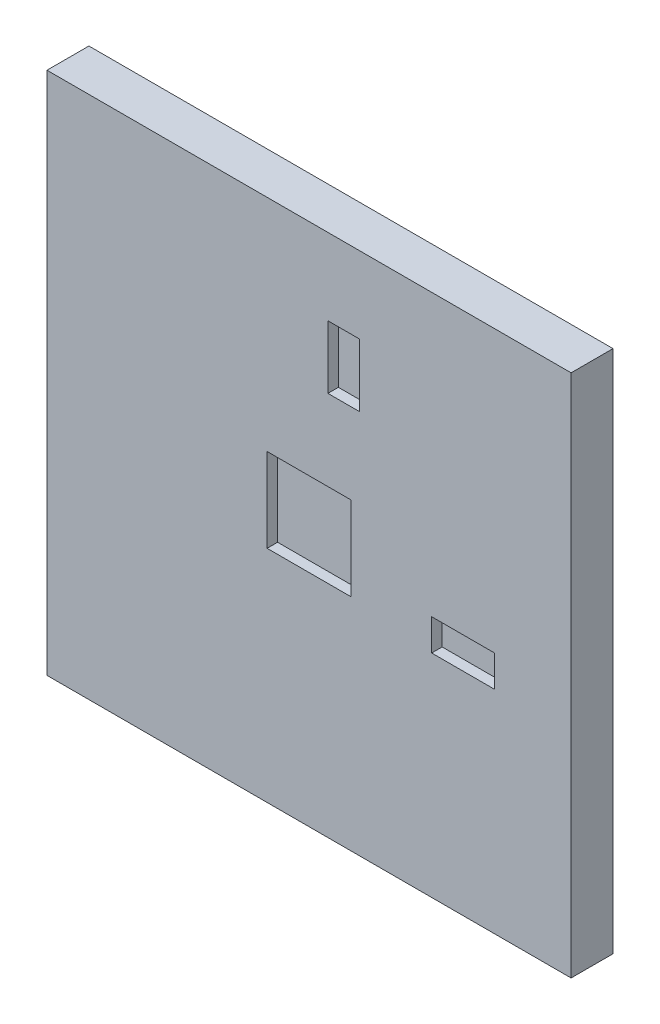
ISO-10303-21;
HEADER;
FILE_DESCRIPTION(('STEP AP214'),'2;1');
FILE_NAME('part.step','',(''),(''),'','','');
FILE_SCHEMA(('AUTOMOTIVE_DESIGN { 1 0 10303 214 1 1 1 1 }'));
ENDSEC;
DATA;
#1=APPLICATION_CONTEXT('core data for automotive mechanical design processes');
#2=APPLICATION_PROTOCOL_DEFINITION('international standard','automotive_design',2000,#1);
#3=PRODUCT_CONTEXT('',#1,'mechanical');
#4=PRODUCT('Part','Part','',(#3));
#5=PRODUCT_RELATED_PRODUCT_CATEGORY('part','',(#4));
#6=PRODUCT_DEFINITION_FORMATION('','',#4);
#7=PRODUCT_DEFINITION_CONTEXT('part definition',#1,'design');
#8=PRODUCT_DEFINITION('design','',#6,#7);
#9=PRODUCT_DEFINITION_SHAPE('','',#8);
#10=(LENGTH_UNIT() NAMED_UNIT(*) SI_UNIT(.MILLI.,.METRE.));
#11=(NAMED_UNIT(*) PLANE_ANGLE_UNIT() SI_UNIT($,.RADIAN.));
#12=(NAMED_UNIT(*) SI_UNIT($,.STERADIAN.) SOLID_ANGLE_UNIT());
#13=UNCERTAINTY_MEASURE_WITH_UNIT(LENGTH_MEASURE(1.E-05),#10,'distance_accuracy_value','');
#14=(GEOMETRIC_REPRESENTATION_CONTEXT(3) GLOBAL_UNCERTAINTY_ASSIGNED_CONTEXT((#13)) GLOBAL_UNIT_ASSIGNED_CONTEXT((#10,
#11,#12)) REPRESENTATION_CONTEXT('',''));
#15=CARTESIAN_POINT('',(0.,0.,0.));
#16=DIRECTION('',(0.,0.,1.));
#17=DIRECTION('',(1.,0.,0.));
#18=AXIS2_PLACEMENT_3D('',#15,#16,#17);
#19=CARTESIAN_POINT('',(147.048407602462,-195.903707865169,20.));
#20=DIRECTION('',(-1.,0.,0.));
#21=DIRECTION('',(0.,0.,1.));
#22=AXIS2_PLACEMENT_3D('',#19,#20,#21);
#23=PLANE('',#22);
#24=DIRECTION('',(0.,1.,0.));
#25=VECTOR('',#24,1.);
#26=CARTESIAN_POINT('',(147.048407602462,-195.903707865169,0.));
#27=LINE('',#26,#25);
#28=CARTESIAN_POINT('',(147.048407602462,-195.903707865169,0.));
#29=VERTEX_POINT('',#28);
#30=CARTESIAN_POINT('',(147.048407602462,54.0962921348315,0.));
#31=VERTEX_POINT('',#30);
#32=EDGE_CURVE('E182',#29,#31,#27,.T.);
#33=ORIENTED_EDGE('',*,*,#32,.T.);
#34=DIRECTION('',(0.,0.,-1.));
#35=VECTOR('',#34,1.);
#36=CARTESIAN_POINT('',(147.048407602462,54.0962921348315,20.));
#37=LINE('',#36,#35);
#38=CARTESIAN_POINT('',(147.048407602462,54.0962921348315,20.));
#39=VERTEX_POINT('',#38);
#40=EDGE_CURVE('E11',#39,#31,#37,.T.);
#41=ORIENTED_EDGE('',*,*,#40,.F.);
#42=DIRECTION('',(0.,1.,0.));
#43=VECTOR('',#42,1.);
#44=CARTESIAN_POINT('',(147.048407602462,-195.903707865169,20.));
#45=LINE('',#44,#43);
#46=CARTESIAN_POINT('',(147.048407602462,-195.903707865169,20.));
#47=VERTEX_POINT('',#46);
#48=EDGE_CURVE('E247',#47,#39,#45,.T.);
#49=ORIENTED_EDGE('',*,*,#48,.F.);
#50=DIRECTION('',(0.,0.,-1.));
#51=VECTOR('',#50,1.);
#52=CARTESIAN_POINT('',(147.048407602462,-195.903707865169,20.));
#53=LINE('',#52,#51);
#54=EDGE_CURVE('E257',#47,#29,#53,.T.);
#55=ORIENTED_EDGE('',*,*,#54,.T.);
#56=EDGE_LOOP('',(#33,#41,#49,#55));
#57=FACE_BOUND('',#56,.T.);
#58=ADVANCED_FACE('F34',(#57),#23,.F.);
#59=CARTESIAN_POINT('',(147.048407602462,54.0962921348315,20.));
#60=DIRECTION('',(0.,-1.,0.));
#61=DIRECTION('',(1.,0.,0.));
#62=AXIS2_PLACEMENT_3D('',#59,#60,#61);
#63=PLANE('',#62);
#64=DIRECTION('',(-1.,0.,0.));
#65=VECTOR('',#64,1.);
#66=CARTESIAN_POINT('',(147.048407602462,54.0962921348315,0.));
#67=LINE('',#66,#65);
#68=CARTESIAN_POINT('',(-102.951592397538,54.0962921348315,0.));
#69=VERTEX_POINT('',#68);
#70=EDGE_CURVE('E260',#31,#69,#67,.T.);
#71=ORIENTED_EDGE('',*,*,#70,.T.);
#72=DIRECTION('',(0.,0.,-1.));
#73=VECTOR('',#72,1.);
#74=CARTESIAN_POINT('',(-102.951592397538,54.0962921348315,20.));
#75=LINE('',#74,#73);
#76=CARTESIAN_POINT('',(-102.951592397538,54.0962921348315,20.));
#77=VERTEX_POINT('',#76);
#78=EDGE_CURVE('E41',#77,#69,#75,.T.);
#79=ORIENTED_EDGE('',*,*,#78,.F.);
#80=DIRECTION('',(-1.,0.,0.));
#81=VECTOR('',#80,1.);
#82=CARTESIAN_POINT('',(147.048407602462,54.0962921348315,20.));
#83=LINE('',#82,#81);
#84=EDGE_CURVE('E250',#39,#77,#83,.T.);
#85=ORIENTED_EDGE('',*,*,#84,.F.);
#86=ORIENTED_EDGE('',*,*,#40,.T.);
#87=EDGE_LOOP('',(#71,#79,#85,#86));
#88=FACE_BOUND('',#87,.T.);
#89=ADVANCED_FACE('F290',(#88),#63,.F.);
#90=CARTESIAN_POINT('',(-102.951592397538,-195.903707865169,20.));
#91=DIRECTION('',(1.,0.,0.));
#92=DIRECTION('',(0.,0.,-1.));
#93=AXIS2_PLACEMENT_3D('',#90,#91,#92);
#94=PLANE('',#93);
#95=DIRECTION('',(0.,-1.,0.));
#96=VECTOR('',#95,1.);
#97=CARTESIAN_POINT('',(-102.951592397538,-195.903707865169,0.));
#98=LINE('',#97,#96);
#99=CARTESIAN_POINT('',(-102.951592397538,-195.903707865169,0.));
#100=VERTEX_POINT('',#99);
#101=EDGE_CURVE('E262',#69,#100,#98,.T.);
#102=ORIENTED_EDGE('',*,*,#101,.T.);
#103=DIRECTION('',(0.,0.,-1.));
#104=VECTOR('',#103,1.);
#105=CARTESIAN_POINT('',(-102.951592397538,-195.903707865169,20.));
#106=LINE('',#105,#104);
#107=CARTESIAN_POINT('',(-102.951592397538,-195.903707865169,20.));
#108=VERTEX_POINT('',#107);
#109=EDGE_CURVE('E267',#108,#100,#106,.T.);
#110=ORIENTED_EDGE('',*,*,#109,.F.);
#111=DIRECTION('',(0.,-1.,0.));
#112=VECTOR('',#111,1.);
#113=CARTESIAN_POINT('',(-102.951592397538,-195.903707865169,20.));
#114=LINE('',#113,#112);
#115=EDGE_CURVE('E253',#77,#108,#114,.T.);
#116=ORIENTED_EDGE('',*,*,#115,.F.);
#117=ORIENTED_EDGE('',*,*,#78,.T.);
#118=EDGE_LOOP('',(#102,#110,#116,#117));
#119=FACE_BOUND('',#118,.T.);
#120=ADVANCED_FACE('F274',(#119),#94,.F.);
#121=CARTESIAN_POINT('',(147.048407602462,-195.903707865169,20.));
#122=DIRECTION('',(0.,1.,0.));
#123=DIRECTION('',(-1.,0.,0.));
#124=AXIS2_PLACEMENT_3D('',#121,#122,#123);
#125=PLANE('',#124);
#126=DIRECTION('',(1.,0.,0.));
#127=VECTOR('',#126,1.);
#128=CARTESIAN_POINT('',(147.048407602462,-195.903707865169,0.));
#129=LINE('',#128,#127);
#130=EDGE_CURVE('E251',#100,#29,#129,.T.);
#131=ORIENTED_EDGE('',*,*,#130,.T.);
#132=ORIENTED_EDGE('',*,*,#54,.F.);
#133=DIRECTION('',(1.,0.,0.));
#134=VECTOR('',#133,1.);
#135=CARTESIAN_POINT('',(147.048407602462,-195.903707865169,20.));
#136=LINE('',#135,#134);
#137=EDGE_CURVE('E255',#108,#47,#136,.T.);
#138=ORIENTED_EDGE('',*,*,#137,.F.);
#139=ORIENTED_EDGE('',*,*,#109,.T.);
#140=EDGE_LOOP('',(#131,#132,#138,#139));
#141=FACE_BOUND('',#140,.T.);
#142=ADVANCED_FACE('F283',(#141),#125,.F.);
#143=CARTESIAN_POINT('',(0.,0.,20.));
#144=DIRECTION('',(0.,0.,1.));
#145=DIRECTION('',(1.,0.,0.));
#146=AXIS2_PLACEMENT_3D('',#143,#144,#145);
#147=PLANE('',#146);
#148=DIRECTION('',(0.,-1.,0.));
#149=VECTOR('',#148,1.);
#150=CARTESIAN_POINT('',(31.0484076024617,17.5962921348315,20.));
#151=LINE('',#150,#149);
#152=CARTESIAN_POINT('',(31.0484076024617,17.5962921348315,20.));
#153=VERTEX_POINT('',#152);
#154=CARTESIAN_POINT('',(31.0484076024617,-12.4037078651685,20.));
#155=VERTEX_POINT('',#154);
#156=EDGE_CURVE('E48',#153,#155,#151,.T.);
#157=ORIENTED_EDGE('',*,*,#156,.F.);
#158=DIRECTION('',(-1.,0.,0.));
#159=VECTOR('',#158,1.);
#160=CARTESIAN_POINT('',(31.0484076024617,17.5962921348315,20.));
#161=LINE('',#160,#159);
#162=CARTESIAN_POINT('',(46.0484076024617,17.5962921348315,20.));
#163=VERTEX_POINT('',#162);
#164=EDGE_CURVE('E166',#163,#153,#161,.T.);
#165=ORIENTED_EDGE('',*,*,#164,.F.);
#166=DIRECTION('',(0.,1.,0.));
#167=VECTOR('',#166,1.);
#168=CARTESIAN_POINT('',(46.0484076024617,17.5962921348315,20.));
#169=LINE('',#168,#167);
#170=CARTESIAN_POINT('',(46.0484076024617,-12.4037078651685,20.));
#171=VERTEX_POINT('',#170);
#172=EDGE_CURVE('E169',#171,#163,#169,.T.);
#173=ORIENTED_EDGE('',*,*,#172,.F.);
#174=DIRECTION('',(1.,0.,0.));
#175=VECTOR('',#174,1.);
#176=CARTESIAN_POINT('',(31.0484076024617,-12.4037078651685,20.));
#177=LINE('',#176,#175);
#178=EDGE_CURVE('E175',#155,#171,#177,.T.);
#179=ORIENTED_EDGE('',*,*,#178,.F.);
#180=EDGE_LOOP('',(#157,#165,#173,#179));
#181=FACE_BOUND('',#180,.T.);
#182=DIRECTION('',(0.,-1.,0.));
#183=VECTOR('',#182,1.);
#184=CARTESIAN_POINT('',(80.5484076024617,-94.9037078651685,20.));
#185=LINE('',#184,#183);
#186=CARTESIAN_POINT('',(80.5484076024617,-79.9037078651685,20.));
#187=VERTEX_POINT('',#186);
#188=CARTESIAN_POINT('',(80.5484076024617,-94.9037078651685,20.));
#189=VERTEX_POINT('',#188);
#190=EDGE_CURVE('E56',#187,#189,#185,.T.);
#191=ORIENTED_EDGE('',*,*,#190,.F.);
#192=DIRECTION('',(-1.,0.,0.));
#193=VECTOR('',#192,1.);
#194=CARTESIAN_POINT('',(80.5484076024617,-79.9037078651685,20.));
#195=LINE('',#194,#193);
#196=CARTESIAN_POINT('',(110.548407602462,-79.9037078651685,20.));
#197=VERTEX_POINT('',#196);
#198=EDGE_CURVE('E190',#197,#187,#195,.T.);
#199=ORIENTED_EDGE('',*,*,#198,.F.);
#200=DIRECTION('',(0.,1.,0.));
#201=VECTOR('',#200,1.);
#202=CARTESIAN_POINT('',(110.548407602462,-94.9037078651685,20.));
#203=LINE('',#202,#201);
#204=CARTESIAN_POINT('',(110.548407602462,-94.9037078651685,20.));
#205=VERTEX_POINT('',#204);
#206=EDGE_CURVE('E205',#205,#197,#203,.T.);
#207=ORIENTED_EDGE('',*,*,#206,.F.);
#208=DIRECTION('',(1.,0.,0.));
#209=VECTOR('',#208,1.);
#210=CARTESIAN_POINT('',(80.5484076024617,-94.9037078651685,20.));
#211=LINE('',#210,#209);
#212=EDGE_CURVE('E201',#189,#205,#211,.T.);
#213=ORIENTED_EDGE('',*,*,#212,.F.);
#214=EDGE_LOOP('',(#191,#199,#207,#213));
#215=FACE_BOUND('',#214,.T.);
#216=DIRECTION('',(0.,-1.,0.));
#217=VECTOR('',#216,1.);
#218=CARTESIAN_POINT('',(2.04840760246174,-50.9037078651685,20.));
#219=LINE('',#218,#217);
#220=CARTESIAN_POINT('',(2.04840760246174,-50.9037078651685,20.));
#221=VERTEX_POINT('',#220);
#222=CARTESIAN_POINT('',(2.04840760246174,-90.9037078651685,20.));
#223=VERTEX_POINT('',#222);
#224=EDGE_CURVE('E230',#221,#223,#219,.T.);
#225=ORIENTED_EDGE('',*,*,#224,.F.);
#226=DIRECTION('',(-1.,0.,0.));
#227=VECTOR('',#226,1.);
#228=CARTESIAN_POINT('',(2.04840760246174,-50.9037078651685,20.));
#229=LINE('',#228,#227);
#230=CARTESIAN_POINT('',(42.0484076024617,-50.9037078651685,20.));
#231=VERTEX_POINT('',#230);
#232=EDGE_CURVE('E220',#231,#221,#229,.T.);
#233=ORIENTED_EDGE('',*,*,#232,.F.);
#234=DIRECTION('',(0.,1.,0.));
#235=VECTOR('',#234,1.);
#236=CARTESIAN_POINT('',(42.0484076024617,-50.9037078651685,20.));
#237=LINE('',#236,#235);
#238=CARTESIAN_POINT('',(42.0484076024617,-90.9037078651685,20.));
#239=VERTEX_POINT('',#238);
#240=EDGE_CURVE('E235',#239,#231,#237,.T.);
#241=ORIENTED_EDGE('',*,*,#240,.F.);
#242=DIRECTION('',(1.,0.,0.));
#243=VECTOR('',#242,1.);
#244=CARTESIAN_POINT('',(2.04840760246174,-90.9037078651685,20.));
#245=LINE('',#244,#243);
#246=EDGE_CURVE('E232',#223,#239,#245,.T.);
#247=ORIENTED_EDGE('',*,*,#246,.F.);
#248=EDGE_LOOP('',(#225,#233,#241,#247));
#249=FACE_BOUND('',#248,.T.);
#250=ORIENTED_EDGE('',*,*,#48,.T.);
#251=ORIENTED_EDGE('',*,*,#84,.T.);
#252=ORIENTED_EDGE('',*,*,#115,.T.);
#253=ORIENTED_EDGE('',*,*,#137,.T.);
#254=EDGE_LOOP('',(#250,#251,#252,#253));
#255=FACE_BOUND('',#254,.T.);
#256=ADVANCED_FACE('F289',(#181,#215,#249,#255),#147,.T.);
#257=CARTESIAN_POINT('',(0.,0.,0.));
#258=DIRECTION('',(0.,0.,1.));
#259=DIRECTION('',(1.,0.,0.));
#260=AXIS2_PLACEMENT_3D('',#257,#258,#259);
#261=PLANE('',#260);
#262=ORIENTED_EDGE('',*,*,#32,.F.);
#263=ORIENTED_EDGE('',*,*,#130,.F.);
#264=ORIENTED_EDGE('',*,*,#101,.F.);
#265=ORIENTED_EDGE('',*,*,#70,.F.);
#266=EDGE_LOOP('',(#262,#263,#264,#265));
#267=FACE_BOUND('',#266,.T.);
#268=ADVANCED_FACE('F280',(#267),#261,.F.);
#269=CARTESIAN_POINT('',(2.04840760246174,-50.9037078651685,15.));
#270=DIRECTION('',(-1.,0.,0.));
#271=DIRECTION('',(0.,-1.,0.));
#272=AXIS2_PLACEMENT_3D('',#269,#270,#271);
#273=PLANE('',#272);
#274=ORIENTED_EDGE('',*,*,#224,.T.);
#275=DIRECTION('',(0.,0.,1.));
#276=VECTOR('',#275,1.);
#277=CARTESIAN_POINT('',(2.04840760246174,-90.9037078651685,15.));
#278=LINE('',#277,#276);
#279=CARTESIAN_POINT('',(2.04840760246174,-90.9037078651685,15.));
#280=VERTEX_POINT('',#279);
#281=EDGE_CURVE('E229',#280,#223,#278,.T.);
#282=ORIENTED_EDGE('',*,*,#281,.F.);
#283=DIRECTION('',(0.,-1.,0.));
#284=VECTOR('',#283,1.);
#285=CARTESIAN_POINT('',(2.04840760246174,-50.9037078651685,15.));
#286=LINE('',#285,#284);
#287=CARTESIAN_POINT('',(2.04840760246174,-50.9037078651685,15.));
#288=VERTEX_POINT('',#287);
#289=EDGE_CURVE('E216',#288,#280,#286,.T.);
#290=ORIENTED_EDGE('',*,*,#289,.F.);
#291=DIRECTION('',(0.,0.,1.));
#292=VECTOR('',#291,1.);
#293=CARTESIAN_POINT('',(2.04840760246174,-50.9037078651685,15.));
#294=LINE('',#293,#292);
#295=EDGE_CURVE('E202',#288,#221,#294,.T.);
#296=ORIENTED_EDGE('',*,*,#295,.T.);
#297=EDGE_LOOP('',(#274,#282,#290,#296));
#298=FACE_BOUND('',#297,.T.);
#299=ADVANCED_FACE('F302',(#298),#273,.F.);
#300=CARTESIAN_POINT('',(2.04840760246174,-50.9037078651685,15.));
#301=DIRECTION('',(0.,1.,0.));
#302=DIRECTION('',(-1.,0.,0.));
#303=AXIS2_PLACEMENT_3D('',#300,#301,#302);
#304=PLANE('',#303);
#305=ORIENTED_EDGE('',*,*,#232,.T.);
#306=ORIENTED_EDGE('',*,*,#295,.F.);
#307=DIRECTION('',(-1.,0.,0.));
#308=VECTOR('',#307,1.);
#309=CARTESIAN_POINT('',(2.04840760246174,-50.9037078651685,15.));
#310=LINE('',#309,#308);
#311=CARTESIAN_POINT('',(42.0484076024617,-50.9037078651685,15.));
#312=VERTEX_POINT('',#311);
#313=EDGE_CURVE('E226',#312,#288,#310,.T.);
#314=ORIENTED_EDGE('',*,*,#313,.F.);
#315=DIRECTION('',(0.,0.,1.));
#316=VECTOR('',#315,1.);
#317=CARTESIAN_POINT('',(42.0484076024617,-50.9037078651685,15.));
#318=LINE('',#317,#316);
#319=EDGE_CURVE('E241',#312,#231,#318,.T.);
#320=ORIENTED_EDGE('',*,*,#319,.T.);
#321=EDGE_LOOP('',(#305,#306,#314,#320));
#322=FACE_BOUND('',#321,.T.);
#323=ADVANCED_FACE('F308',(#322),#304,.F.);
#324=CARTESIAN_POINT('',(42.0484076024617,-50.9037078651685,15.));
#325=DIRECTION('',(1.,0.,0.));
#326=DIRECTION('',(0.,1.,0.));
#327=AXIS2_PLACEMENT_3D('',#324,#325,#326);
#328=PLANE('',#327);
#329=ORIENTED_EDGE('',*,*,#240,.T.);
#330=ORIENTED_EDGE('',*,*,#319,.F.);
#331=DIRECTION('',(0.,1.,0.));
#332=VECTOR('',#331,1.);
#333=CARTESIAN_POINT('',(42.0484076024617,-50.9037078651685,15.));
#334=LINE('',#333,#332);
#335=CARTESIAN_POINT('',(42.0484076024617,-90.9037078651685,15.));
#336=VERTEX_POINT('',#335);
#337=EDGE_CURVE('E223',#336,#312,#334,.T.);
#338=ORIENTED_EDGE('',*,*,#337,.F.);
#339=DIRECTION('',(0.,0.,1.));
#340=VECTOR('',#339,1.);
#341=CARTESIAN_POINT('',(42.0484076024617,-90.9037078651685,15.));
#342=LINE('',#341,#340);
#343=EDGE_CURVE('E243',#336,#239,#342,.T.);
#344=ORIENTED_EDGE('',*,*,#343,.T.);
#345=EDGE_LOOP('',(#329,#330,#338,#344));
#346=FACE_BOUND('',#345,.T.);
#347=ADVANCED_FACE('F314',(#346),#328,.F.);
#348=CARTESIAN_POINT('',(2.04840760246174,-90.9037078651685,15.));
#349=DIRECTION('',(0.,-1.,0.));
#350=DIRECTION('',(0.,0.,-1.));
#351=AXIS2_PLACEMENT_3D('',#348,#349,#350);
#352=PLANE('',#351);
#353=ORIENTED_EDGE('',*,*,#246,.T.);
#354=ORIENTED_EDGE('',*,*,#343,.F.);
#355=DIRECTION('',(1.,0.,0.));
#356=VECTOR('',#355,1.);
#357=CARTESIAN_POINT('',(2.04840760246174,-90.9037078651685,15.));
#358=LINE('',#357,#356);
#359=EDGE_CURVE('E219',#280,#336,#358,.T.);
#360=ORIENTED_EDGE('',*,*,#359,.F.);
#361=ORIENTED_EDGE('',*,*,#281,.T.);
#362=EDGE_LOOP('',(#353,#354,#360,#361));
#363=FACE_BOUND('',#362,.T.);
#364=ADVANCED_FACE('F310',(#363),#352,.F.);
#365=CARTESIAN_POINT('',(0.,0.,15.));
#366=DIRECTION('',(0.,0.,1.));
#367=DIRECTION('',(1.,0.,0.));
#368=AXIS2_PLACEMENT_3D('',#365,#366,#367);
#369=PLANE('',#368);
#370=ORIENTED_EDGE('',*,*,#289,.T.);
#371=ORIENTED_EDGE('',*,*,#359,.T.);
#372=ORIENTED_EDGE('',*,*,#337,.T.);
#373=ORIENTED_EDGE('',*,*,#313,.T.);
#374=EDGE_LOOP('',(#370,#371,#372,#373));
#375=FACE_BOUND('',#374,.T.);
#376=ADVANCED_FACE('F313',(#375),#369,.T.);
#377=CARTESIAN_POINT('',(80.5484076024617,-94.9037078651685,15.));
#378=DIRECTION('',(-1.,0.,0.));
#379=DIRECTION('',(0.,0.,1.));
#380=AXIS2_PLACEMENT_3D('',#377,#378,#379);
#381=PLANE('',#380);
#382=ORIENTED_EDGE('',*,*,#190,.T.);
#383=DIRECTION('',(0.,0.,1.));
#384=VECTOR('',#383,1.);
#385=CARTESIAN_POINT('',(80.5484076024617,-94.9037078651685,15.));
#386=LINE('',#385,#384);
#387=CARTESIAN_POINT('',(80.5484076024617,-94.9037078651685,15.));
#388=VERTEX_POINT('',#387);
#389=EDGE_CURVE('E199',#388,#189,#386,.T.);
#390=ORIENTED_EDGE('',*,*,#389,.F.);
#391=DIRECTION('',(0.,-1.,0.));
#392=VECTOR('',#391,1.);
#393=CARTESIAN_POINT('',(80.5484076024617,-94.9037078651685,15.));
#394=LINE('',#393,#392);
#395=CARTESIAN_POINT('',(80.5484076024617,-79.9037078651685,15.));
#396=VERTEX_POINT('',#395);
#397=EDGE_CURVE('E186',#396,#388,#394,.T.);
#398=ORIENTED_EDGE('',*,*,#397,.F.);
#399=DIRECTION('',(0.,0.,1.));
#400=VECTOR('',#399,1.);
#401=CARTESIAN_POINT('',(80.5484076024617,-79.9037078651685,15.));
#402=LINE('',#401,#400);
#403=EDGE_CURVE('E176',#396,#187,#402,.T.);
#404=ORIENTED_EDGE('',*,*,#403,.T.);
#405=EDGE_LOOP('',(#382,#390,#398,#404));
#406=FACE_BOUND('',#405,.T.);
#407=ADVANCED_FACE('F324',(#406),#381,.F.);
#408=CARTESIAN_POINT('',(80.5484076024617,-79.9037078651685,15.));
#409=DIRECTION('',(0.,1.,0.));
#410=DIRECTION('',(0.,0.,1.));
#411=AXIS2_PLACEMENT_3D('',#408,#409,#410);
#412=PLANE('',#411);
#413=ORIENTED_EDGE('',*,*,#198,.T.);
#414=ORIENTED_EDGE('',*,*,#403,.F.);
#415=DIRECTION('',(-1.,0.,0.));
#416=VECTOR('',#415,1.);
#417=CARTESIAN_POINT('',(80.5484076024617,-79.9037078651685,15.));
#418=LINE('',#417,#416);
#419=CARTESIAN_POINT('',(110.548407602462,-79.9037078651685,15.));
#420=VERTEX_POINT('',#419);
#421=EDGE_CURVE('E196',#420,#396,#418,.T.);
#422=ORIENTED_EDGE('',*,*,#421,.F.);
#423=DIRECTION('',(0.,0.,1.));
#424=VECTOR('',#423,1.);
#425=CARTESIAN_POINT('',(110.548407602462,-79.9037078651685,15.));
#426=LINE('',#425,#424);
#427=EDGE_CURVE('E211',#420,#197,#426,.T.);
#428=ORIENTED_EDGE('',*,*,#427,.T.);
#429=EDGE_LOOP('',(#413,#414,#422,#428));
#430=FACE_BOUND('',#429,.T.);
#431=ADVANCED_FACE('F328',(#430),#412,.F.);
#432=CARTESIAN_POINT('',(110.548407602462,-94.9037078651685,15.));
#433=DIRECTION('',(1.,0.,0.));
#434=DIRECTION('',(0.,0.,-1.));
#435=AXIS2_PLACEMENT_3D('',#432,#433,#434);
#436=PLANE('',#435);
#437=ORIENTED_EDGE('',*,*,#206,.T.);
#438=ORIENTED_EDGE('',*,*,#427,.F.);
#439=DIRECTION('',(0.,1.,0.));
#440=VECTOR('',#439,1.);
#441=CARTESIAN_POINT('',(110.548407602462,-94.9037078651685,15.));
#442=LINE('',#441,#440);
#443=CARTESIAN_POINT('',(110.548407602462,-94.9037078651685,15.));
#444=VERTEX_POINT('',#443);
#445=EDGE_CURVE('E193',#444,#420,#442,.T.);
#446=ORIENTED_EDGE('',*,*,#445,.F.);
#447=DIRECTION('',(0.,0.,1.));
#448=VECTOR('',#447,1.);
#449=CARTESIAN_POINT('',(110.548407602462,-94.9037078651685,15.));
#450=LINE('',#449,#448);
#451=EDGE_CURVE('E213',#444,#205,#450,.T.);
#452=ORIENTED_EDGE('',*,*,#451,.T.);
#453=EDGE_LOOP('',(#437,#438,#446,#452));
#454=FACE_BOUND('',#453,.T.);
#455=ADVANCED_FACE('F333',(#454),#436,.F.);
#456=CARTESIAN_POINT('',(80.5484076024617,-94.9037078651685,15.));
#457=DIRECTION('',(0.,-1.,0.));
#458=DIRECTION('',(0.,0.,-1.));
#459=AXIS2_PLACEMENT_3D('',#456,#457,#458);
#460=PLANE('',#459);
#461=ORIENTED_EDGE('',*,*,#212,.T.);
#462=ORIENTED_EDGE('',*,*,#451,.F.);
#463=DIRECTION('',(1.,0.,0.));
#464=VECTOR('',#463,1.);
#465=CARTESIAN_POINT('',(80.5484076024617,-94.9037078651685,15.));
#466=LINE('',#465,#464);
#467=EDGE_CURVE('E189',#388,#444,#466,.T.);
#468=ORIENTED_EDGE('',*,*,#467,.F.);
#469=ORIENTED_EDGE('',*,*,#389,.T.);
#470=EDGE_LOOP('',(#461,#462,#468,#469));
#471=FACE_BOUND('',#470,.T.);
#472=ADVANCED_FACE('F329',(#471),#460,.F.);
#473=CARTESIAN_POINT('',(0.,0.,15.));
#474=DIRECTION('',(0.,0.,-1.));
#475=DIRECTION('',(-1.,0.,0.));
#476=AXIS2_PLACEMENT_3D('',#473,#474,#475);
#477=PLANE('',#476);
#478=ORIENTED_EDGE('',*,*,#397,.T.);
#479=ORIENTED_EDGE('',*,*,#467,.T.);
#480=ORIENTED_EDGE('',*,*,#445,.T.);
#481=ORIENTED_EDGE('',*,*,#421,.T.);
#482=EDGE_LOOP('',(#478,#479,#480,#481));
#483=FACE_BOUND('',#482,.T.);
#484=ADVANCED_FACE('F332',(#483),#477,.F.);
#485=CARTESIAN_POINT('',(31.0484076024617,17.5962921348315,15.));
#486=DIRECTION('',(-1.,0.,0.));
#487=DIRECTION('',(0.,-1.,0.));
#488=AXIS2_PLACEMENT_3D('',#485,#486,#487);
#489=PLANE('',#488);
#490=ORIENTED_EDGE('',*,*,#156,.T.);
#491=DIRECTION('',(0.,0.,1.));
#492=VECTOR('',#491,1.);
#493=CARTESIAN_POINT('',(31.0484076024617,-12.4037078651685,15.));
#494=LINE('',#493,#492);
#495=CARTESIAN_POINT('',(31.0484076024617,-12.4037078651685,15.));
#496=VERTEX_POINT('',#495);
#497=EDGE_CURVE('E144',#496,#155,#494,.T.);
#498=ORIENTED_EDGE('',*,*,#497,.F.);
#499=DIRECTION('',(0.,-1.,0.));
#500=VECTOR('',#499,1.);
#501=CARTESIAN_POINT('',(31.0484076024617,17.5962921348315,15.));
#502=LINE('',#501,#500);
#503=CARTESIAN_POINT('',(31.0484076024617,17.5962921348315,15.));
#504=VERTEX_POINT('',#503);
#505=EDGE_CURVE('E148',#504,#496,#502,.T.);
#506=ORIENTED_EDGE('',*,*,#505,.F.);
#507=DIRECTION('',(0.,0.,1.));
#508=VECTOR('',#507,1.);
#509=CARTESIAN_POINT('',(31.0484076024617,17.5962921348315,15.));
#510=LINE('',#509,#508);
#511=EDGE_CURVE('E180',#504,#153,#510,.T.);
#512=ORIENTED_EDGE('',*,*,#511,.T.);
#513=EDGE_LOOP('',(#490,#498,#506,#512));
#514=FACE_BOUND('',#513,.T.);
#515=ADVANCED_FACE('F146',(#514),#489,.F.);
#516=CARTESIAN_POINT('',(31.0484076024617,17.5962921348315,15.));
#517=DIRECTION('',(0.,1.,0.));
#518=DIRECTION('',(0.,0.,1.));
#519=AXIS2_PLACEMENT_3D('',#516,#517,#518);
#520=PLANE('',#519);
#521=ORIENTED_EDGE('',*,*,#164,.T.);
#522=ORIENTED_EDGE('',*,*,#511,.F.);
#523=DIRECTION('',(-1.,0.,0.));
#524=VECTOR('',#523,1.);
#525=CARTESIAN_POINT('',(31.0484076024617,17.5962921348315,15.));
#526=LINE('',#525,#524);
#527=CARTESIAN_POINT('',(46.0484076024617,17.5962921348315,15.));
#528=VERTEX_POINT('',#527);
#529=EDGE_CURVE('E154',#528,#504,#526,.T.);
#530=ORIENTED_EDGE('',*,*,#529,.F.);
#531=DIRECTION('',(0.,0.,1.));
#532=VECTOR('',#531,1.);
#533=CARTESIAN_POINT('',(46.0484076024617,17.5962921348315,15.));
#534=LINE('',#533,#532);
#535=EDGE_CURVE('E183',#528,#163,#534,.T.);
#536=ORIENTED_EDGE('',*,*,#535,.T.);
#537=EDGE_LOOP('',(#521,#522,#530,#536));
#538=FACE_BOUND('',#537,.T.);
#539=ADVANCED_FACE('F346',(#538),#520,.F.);
#540=CARTESIAN_POINT('',(46.0484076024617,17.5962921348315,15.));
#541=DIRECTION('',(1.,0.,0.));
#542=DIRECTION('',(0.,1.,0.));
#543=AXIS2_PLACEMENT_3D('',#540,#541,#542);
#544=PLANE('',#543);
#545=ORIENTED_EDGE('',*,*,#172,.T.);
#546=ORIENTED_EDGE('',*,*,#535,.F.);
#547=DIRECTION('',(0.,1.,0.));
#548=VECTOR('',#547,1.);
#549=CARTESIAN_POINT('',(46.0484076024617,17.5962921348315,15.));
#550=LINE('',#549,#548);
#551=CARTESIAN_POINT('',(46.0484076024617,-12.4037078651685,15.));
#552=VERTEX_POINT('',#551);
#553=EDGE_CURVE('E162',#552,#528,#550,.T.);
#554=ORIENTED_EDGE('',*,*,#553,.F.);
#555=DIRECTION('',(0.,0.,1.));
#556=VECTOR('',#555,1.);
#557=CARTESIAN_POINT('',(46.0484076024617,-12.4037078651685,15.));
#558=LINE('',#557,#556);
#559=EDGE_CURVE('E153',#552,#171,#558,.T.);
#560=ORIENTED_EDGE('',*,*,#559,.T.);
#561=EDGE_LOOP('',(#545,#546,#554,#560));
#562=FACE_BOUND('',#561,.T.);
#563=ADVANCED_FACE('F349',(#562),#544,.F.);
#564=CARTESIAN_POINT('',(31.0484076024617,-12.4037078651685,15.));
#565=DIRECTION('',(0.,-1.,0.));
#566=DIRECTION('',(0.,0.,-1.));
#567=AXIS2_PLACEMENT_3D('',#564,#565,#566);
#568=PLANE('',#567);
#569=ORIENTED_EDGE('',*,*,#178,.T.);
#570=ORIENTED_EDGE('',*,*,#559,.F.);
#571=DIRECTION('',(1.,0.,0.));
#572=VECTOR('',#571,1.);
#573=CARTESIAN_POINT('',(31.0484076024617,-12.4037078651685,15.));
#574=LINE('',#573,#572);
#575=EDGE_CURVE('E157',#496,#552,#574,.T.);
#576=ORIENTED_EDGE('',*,*,#575,.F.);
#577=ORIENTED_EDGE('',*,*,#497,.T.);
#578=EDGE_LOOP('',(#569,#570,#576,#577));
#579=FACE_BOUND('',#578,.T.);
#580=ADVANCED_FACE('F158',(#579),#568,.F.);
#581=CARTESIAN_POINT('',(0.,0.,15.));
#582=DIRECTION('',(0.,0.,1.));
#583=DIRECTION('',(1.,0.,0.));
#584=AXIS2_PLACEMENT_3D('',#581,#582,#583);
#585=PLANE('',#584);
#586=ORIENTED_EDGE('',*,*,#505,.T.);
#587=ORIENTED_EDGE('',*,*,#575,.T.);
#588=ORIENTED_EDGE('',*,*,#553,.T.);
#589=ORIENTED_EDGE('',*,*,#529,.T.);
#590=EDGE_LOOP('',(#586,#587,#588,#589));
#591=FACE_BOUND('',#590,.T.);
#592=ADVANCED_FACE('F164',(#591),#585,.T.);
#593=CLOSED_SHELL('',(#58,#89,#120,#142,#256,#268,#299,#323,#347,#364,#376,#407,#431,#455,#472,
#484,#515,#539,#563,#580,#592));
#594=MANIFOLD_SOLID_BREP('B2',#593);
#595=ADVANCED_BREP_SHAPE_REPRESENTATION('',(#18,#594),#14);
#596=SHAPE_DEFINITION_REPRESENTATION(#9,#595);
ENDSEC;
END-ISO-10303-21;
